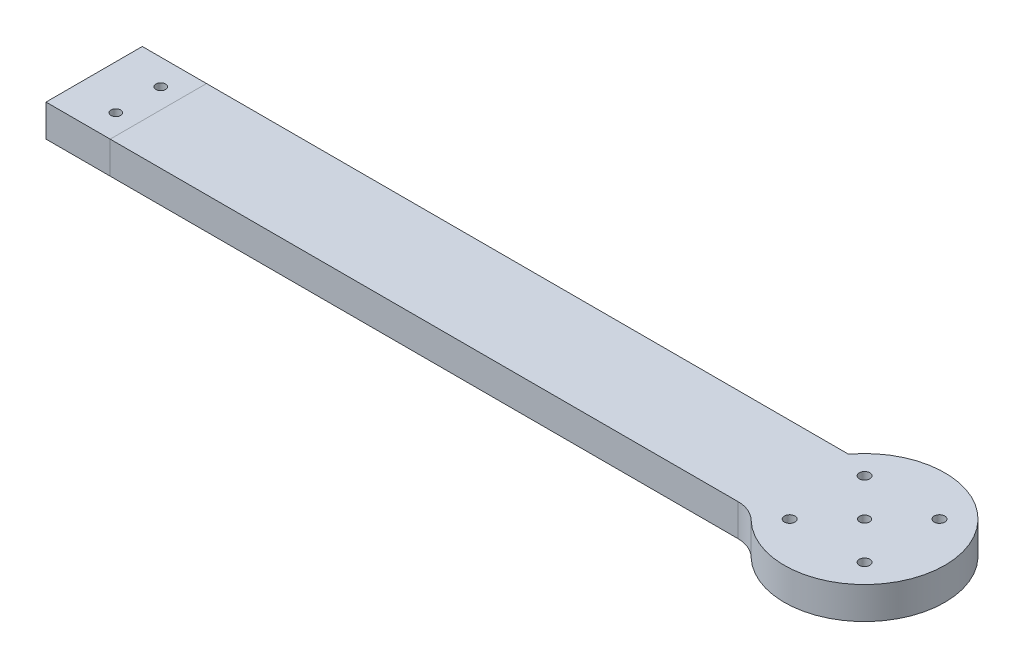
ISO-10303-21;
HEADER;
FILE_DESCRIPTION(('STEP AP214'),'2;1');
FILE_NAME('part.step','',(''),(''),'','','');
FILE_SCHEMA(('AUTOMOTIVE_DESIGN { 1 0 10303 214 1 1 1 1 }'));
ENDSEC;
DATA;
#1=APPLICATION_CONTEXT('core data for automotive mechanical design processes');
#2=APPLICATION_PROTOCOL_DEFINITION('international standard','automotive_design',2000,#1);
#3=PRODUCT_CONTEXT('',#1,'mechanical');
#4=PRODUCT('Part','Part','',(#3));
#5=PRODUCT_RELATED_PRODUCT_CATEGORY('part','',(#4));
#6=PRODUCT_DEFINITION_FORMATION('','',#4);
#7=PRODUCT_DEFINITION_CONTEXT('part definition',#1,'design');
#8=PRODUCT_DEFINITION('design','',#6,#7);
#9=PRODUCT_DEFINITION_SHAPE('','',#8);
#10=(LENGTH_UNIT() NAMED_UNIT(*) SI_UNIT(.MILLI.,.METRE.));
#11=(NAMED_UNIT(*) PLANE_ANGLE_UNIT() SI_UNIT($,.RADIAN.));
#12=(NAMED_UNIT(*) SI_UNIT($,.STERADIAN.) SOLID_ANGLE_UNIT());
#13=UNCERTAINTY_MEASURE_WITH_UNIT(LENGTH_MEASURE(1.E-05),#10,'distance_accuracy_value','');
#14=(GEOMETRIC_REPRESENTATION_CONTEXT(3) GLOBAL_UNCERTAINTY_ASSIGNED_CONTEXT((#13)) GLOBAL_UNIT_ASSIGNED_CONTEXT((#10,
#11,#12)) REPRESENTATION_CONTEXT('',''));
#15=CARTESIAN_POINT('',(0.,0.,0.));
#16=DIRECTION('',(0.,0.,1.));
#17=DIRECTION('',(1.,0.,0.));
#18=AXIS2_PLACEMENT_3D('',#15,#16,#17);
#19=CARTESIAN_POINT('',(-20.,10.,-30.));
#20=DIRECTION('',(0.,0.,1.));
#21=DIRECTION('',(1.,0.,0.));
#22=AXIS2_PLACEMENT_3D('',#19,#20,#21);
#23=PLANE('',#22);
#24=DIRECTION('',(0.,-1.,0.));
#25=VECTOR('',#24,1.);
#26=CARTESIAN_POINT('',(0.,10.,-30.));
#27=LINE('',#26,#25);
#28=CARTESIAN_POINT('',(0.,10.,-30.));
#29=VERTEX_POINT('',#28);
#30=CARTESIAN_POINT('',(0.,0.,-30.));
#31=VERTEX_POINT('',#30);
#32=EDGE_CURVE('E120',#29,#31,#27,.T.);
#33=ORIENTED_EDGE('',*,*,#32,.T.);
#34=DIRECTION('',(1.,0.,0.));
#35=VECTOR('',#34,1.);
#36=CARTESIAN_POINT('',(-20.,0.,-30.));
#37=LINE('',#36,#35);
#38=CARTESIAN_POINT('',(-20.,0.,-30.));
#39=VERTEX_POINT('',#38);
#40=EDGE_CURVE('E12',#39,#31,#37,.T.);
#41=ORIENTED_EDGE('',*,*,#40,.F.);
#42=DIRECTION('',(0.,-1.,0.));
#43=VECTOR('',#42,1.);
#44=CARTESIAN_POINT('',(-20.,10.,-30.));
#45=LINE('',#44,#43);
#46=CARTESIAN_POINT('',(-20.,10.,-30.));
#47=VERTEX_POINT('',#46);
#48=EDGE_CURVE('E108',#47,#39,#45,.T.);
#49=ORIENTED_EDGE('',*,*,#48,.F.);
#50=DIRECTION('',(1.,0.,0.));
#51=VECTOR('',#50,1.);
#52=CARTESIAN_POINT('',(-20.,10.,-30.));
#53=LINE('',#52,#51);
#54=EDGE_CURVE('E116',#47,#29,#53,.T.);
#55=ORIENTED_EDGE('',*,*,#54,.T.);
#56=EDGE_LOOP('',(#33,#41,#49,#55));
#57=FACE_BOUND('',#56,.T.);
#58=ADVANCED_FACE('F57',(#57),#23,.F.);
#59=CARTESIAN_POINT('',(-20.,0.,-30.));
#60=DIRECTION('',(0.,1.,0.));
#61=DIRECTION('',(0.,0.,1.));
#62=AXIS2_PLACEMENT_3D('',#59,#60,#61);
#63=PLANE('',#62);
#64=CARTESIAN_POINT('',(-6.25,0.,-8.));
#65=DIRECTION('',(0.,1.,0.));
#66=DIRECTION('',(0.,0.,1.));
#67=AXIS2_PLACEMENT_3D('',#64,#65,#66);
#68=CIRCLE('',#67,1.5);
#69=CARTESIAN_POINT('',(-6.25,0.,-6.5));
#70=VERTEX_POINT('',#69);
#71=EDGE_CURVE('E123',#70,#70,#68,.F.);
#72=ORIENTED_EDGE('',*,*,#71,.F.);
#73=EDGE_LOOP('',(#72));
#74=FACE_BOUND('',#73,.T.);
#75=CARTESIAN_POINT('',(-6.25,0.,-22.));
#76=DIRECTION('',(0.,1.,0.));
#77=DIRECTION('',(0.,0.,1.));
#78=AXIS2_PLACEMENT_3D('',#75,#76,#77);
#79=CIRCLE('',#78,1.5);
#80=CARTESIAN_POINT('',(-6.25,0.,-20.5));
#81=VERTEX_POINT('',#80);
#82=EDGE_CURVE('E138',#81,#81,#79,.F.);
#83=ORIENTED_EDGE('',*,*,#82,.F.);
#84=EDGE_LOOP('',(#83));
#85=FACE_BOUND('',#84,.T.);
#86=DIRECTION('',(0.,0.,1.));
#87=VECTOR('',#86,1.);
#88=CARTESIAN_POINT('',(0.,0.,-30.));
#89=LINE('',#88,#87);
#90=CARTESIAN_POINT('',(0.,0.,0.));
#91=VERTEX_POINT('',#90);
#92=EDGE_CURVE('E112',#31,#91,#89,.T.);
#93=ORIENTED_EDGE('',*,*,#92,.T.);
#94=DIRECTION('',(1.,0.,0.));
#95=VECTOR('',#94,1.);
#96=CARTESIAN_POINT('',(-20.,0.,0.));
#97=LINE('',#96,#95);
#98=CARTESIAN_POINT('',(-20.,0.,0.));
#99=VERTEX_POINT('',#98);
#100=EDGE_CURVE('E65',#99,#91,#97,.T.);
#101=ORIENTED_EDGE('',*,*,#100,.F.);
#102=DIRECTION('',(0.,0.,1.));
#103=VECTOR('',#102,1.);
#104=CARTESIAN_POINT('',(-20.,0.,-30.));
#105=LINE('',#104,#103);
#106=EDGE_CURVE('E103',#39,#99,#105,.T.);
#107=ORIENTED_EDGE('',*,*,#106,.F.);
#108=ORIENTED_EDGE('',*,*,#40,.T.);
#109=EDGE_LOOP('',(#93,#101,#107,#108));
#110=FACE_BOUND('',#109,.T.);
#111=ADVANCED_FACE('F111',(#74,#85,#110),#63,.F.);
#112=CARTESIAN_POINT('',(-20.,0.,0.));
#113=DIRECTION('',(0.,0.,-1.));
#114=DIRECTION('',(-1.,0.,0.));
#115=AXIS2_PLACEMENT_3D('',#112,#113,#114);
#116=PLANE('',#115);
#117=DIRECTION('',(0.,1.,0.));
#118=VECTOR('',#117,1.);
#119=CARTESIAN_POINT('',(0.,0.,0.));
#120=LINE('',#119,#118);
#121=CARTESIAN_POINT('',(0.,10.,0.));
#122=VERTEX_POINT('',#121);
#123=EDGE_CURVE('E90',#91,#122,#120,.T.);
#124=ORIENTED_EDGE('',*,*,#123,.T.);
#125=DIRECTION('',(1.,0.,0.));
#126=VECTOR('',#125,1.);
#127=CARTESIAN_POINT('',(-20.,10.,0.));
#128=LINE('',#127,#126);
#129=CARTESIAN_POINT('',(-20.,10.,0.));
#130=VERTEX_POINT('',#129);
#131=EDGE_CURVE('E113',#130,#122,#128,.T.);
#132=ORIENTED_EDGE('',*,*,#131,.F.);
#133=DIRECTION('',(0.,1.,0.));
#134=VECTOR('',#133,1.);
#135=CARTESIAN_POINT('',(-20.,0.,0.));
#136=LINE('',#135,#134);
#137=EDGE_CURVE('E106',#99,#130,#136,.T.);
#138=ORIENTED_EDGE('',*,*,#137,.F.);
#139=ORIENTED_EDGE('',*,*,#100,.T.);
#140=EDGE_LOOP('',(#124,#132,#138,#139));
#141=FACE_BOUND('',#140,.T.);
#142=ADVANCED_FACE('F114',(#141),#116,.F.);
#143=CARTESIAN_POINT('',(-20.,10.,0.));
#144=DIRECTION('',(0.,-1.,0.));
#145=DIRECTION('',(0.,0.,-1.));
#146=AXIS2_PLACEMENT_3D('',#143,#144,#145);
#147=PLANE('',#146);
#148=CARTESIAN_POINT('',(-6.25,10.,-8.));
#149=DIRECTION('',(0.,1.,0.));
#150=DIRECTION('',(0.,0.,1.));
#151=AXIS2_PLACEMENT_3D('',#148,#149,#150);
#152=CIRCLE('',#151,1.5);
#153=CARTESIAN_POINT('',(-6.25,10.,-6.5));
#154=VERTEX_POINT('',#153);
#155=EDGE_CURVE('E137',#154,#154,#152,.T.);
#156=ORIENTED_EDGE('',*,*,#155,.F.);
#157=EDGE_LOOP('',(#156));
#158=FACE_BOUND('',#157,.T.);
#159=CARTESIAN_POINT('',(-6.25,10.,-22.));
#160=DIRECTION('',(0.,1.,0.));
#161=DIRECTION('',(0.,0.,1.));
#162=AXIS2_PLACEMENT_3D('',#159,#160,#161);
#163=CIRCLE('',#162,1.5);
#164=CARTESIAN_POINT('',(-6.25,10.,-20.5));
#165=VERTEX_POINT('',#164);
#166=EDGE_CURVE('E134',#165,#165,#163,.T.);
#167=ORIENTED_EDGE('',*,*,#166,.F.);
#168=EDGE_LOOP('',(#167));
#169=FACE_BOUND('',#168,.T.);
#170=DIRECTION('',(0.,0.,-1.));
#171=VECTOR('',#170,1.);
#172=CARTESIAN_POINT('',(0.,10.,0.));
#173=LINE('',#172,#171);
#174=EDGE_CURVE('E96',#122,#29,#173,.T.);
#175=ORIENTED_EDGE('',*,*,#174,.T.);
#176=ORIENTED_EDGE('',*,*,#54,.F.);
#177=DIRECTION('',(0.,0.,-1.));
#178=VECTOR('',#177,1.);
#179=CARTESIAN_POINT('',(-20.,10.,0.));
#180=LINE('',#179,#178);
#181=EDGE_CURVE('E73',#130,#47,#180,.T.);
#182=ORIENTED_EDGE('',*,*,#181,.F.);
#183=ORIENTED_EDGE('',*,*,#131,.T.);
#184=EDGE_LOOP('',(#175,#176,#182,#183));
#185=FACE_BOUND('',#184,.T.);
#186=ADVANCED_FACE('F128',(#158,#169,#185),#147,.F.);
#187=CARTESIAN_POINT('',(-20.,0.,0.));
#188=DIRECTION('',(-1.,0.,0.));
#189=DIRECTION('',(0.,0.,1.));
#190=AXIS2_PLACEMENT_3D('',#187,#188,#189);
#191=PLANE('',#190);
#192=ORIENTED_EDGE('',*,*,#48,.T.);
#193=ORIENTED_EDGE('',*,*,#106,.T.);
#194=ORIENTED_EDGE('',*,*,#137,.T.);
#195=ORIENTED_EDGE('',*,*,#181,.T.);
#196=EDGE_LOOP('',(#192,#193,#194,#195));
#197=FACE_BOUND('',#196,.T.);
#198=ADVANCED_FACE('F104',(#197),#191,.T.);
#199=CARTESIAN_POINT('',(0.,0.,0.));
#200=DIRECTION('',(-1.,0.,0.));
#201=DIRECTION('',(0.,0.,1.));
#202=AXIS2_PLACEMENT_3D('',#199,#200,#201);
#203=PLANE('',#202);
#204=ORIENTED_EDGE('',*,*,#32,.F.);
#205=ORIENTED_EDGE('',*,*,#174,.F.);
#206=ORIENTED_EDGE('',*,*,#123,.F.);
#207=ORIENTED_EDGE('',*,*,#92,.F.);
#208=EDGE_LOOP('',(#204,#205,#206,#207));
#209=FACE_BOUND('',#208,.T.);
#210=ADVANCED_FACE('F131',(#209),#203,.F.);
#211=CARTESIAN_POINT('',(-6.25,-4.24264068711929,-22.));
#212=DIRECTION('',(0.,1.,0.));
#213=DIRECTION('',(0.,0.,1.));
#214=AXIS2_PLACEMENT_3D('',#211,#212,#213);
#215=CYLINDRICAL_SURFACE('',#214,1.5);
#216=ORIENTED_EDGE('',*,*,#82,.T.);
#217=EDGE_LOOP('',(#216));
#218=FACE_BOUND('',#217,.T.);
#219=ORIENTED_EDGE('',*,*,#166,.T.);
#220=EDGE_LOOP('',(#219));
#221=FACE_BOUND('',#220,.T.);
#222=ADVANCED_FACE('F153',(#218,#221),#215,.F.);
#223=CARTESIAN_POINT('',(-6.25,-4.24264068711929,-8.));
#224=DIRECTION('',(0.,1.,0.));
#225=DIRECTION('',(0.,0.,1.));
#226=AXIS2_PLACEMENT_3D('',#223,#224,#225);
#227=CYLINDRICAL_SURFACE('',#226,1.5);
#228=ORIENTED_EDGE('',*,*,#71,.T.);
#229=EDGE_LOOP('',(#228));
#230=FACE_BOUND('',#229,.T.);
#231=ORIENTED_EDGE('',*,*,#155,.T.);
#232=EDGE_LOOP('',(#231));
#233=FACE_BOUND('',#232,.T.);
#234=ADVANCED_FACE('F146',(#230,#233),#227,.F.);
#235=CLOSED_SHELL('',(#58,#111,#142,#186,#198,#210,#222,#234));
#236=MANIFOLD_SOLID_BREP('B2',#235);
#237=CARTESIAN_POINT('',(0.,10.,0.));
#238=DIRECTION('',(1.,0.,0.));
#239=DIRECTION('',(0.,0.,-1.));
#240=AXIS2_PLACEMENT_3D('',#237,#238,#239);
#241=PLANE('',#240);
#242=DIRECTION('',(0.,0.,1.));
#243=VECTOR('',#242,1.);
#244=CARTESIAN_POINT('',(0.,0.,0.));
#245=LINE('',#244,#243);
#246=CARTESIAN_POINT('',(0.,0.,-30.));
#247=VERTEX_POINT('',#246);
#248=CARTESIAN_POINT('',(0.,0.,0.));
#249=VERTEX_POINT('',#248);
#250=EDGE_CURVE('E290',#247,#249,#245,.T.);
#251=ORIENTED_EDGE('',*,*,#250,.T.);
#252=DIRECTION('',(0.,-1.,0.));
#253=VECTOR('',#252,1.);
#254=CARTESIAN_POINT('',(0.,10.,0.));
#255=LINE('',#254,#253);
#256=CARTESIAN_POINT('',(0.,10.,0.));
#257=VERTEX_POINT('',#256);
#258=EDGE_CURVE('E271',#257,#249,#255,.T.);
#259=ORIENTED_EDGE('',*,*,#258,.F.);
#260=DIRECTION('',(0.,0.,1.));
#261=VECTOR('',#260,1.);
#262=CARTESIAN_POINT('',(0.,10.,0.));
#263=LINE('',#262,#261);
#264=CARTESIAN_POINT('',(0.,10.,-30.));
#265=VERTEX_POINT('',#264);
#266=EDGE_CURVE('E277',#265,#257,#263,.T.);
#267=ORIENTED_EDGE('',*,*,#266,.F.);
#268=DIRECTION('',(0.,-1.,0.));
#269=VECTOR('',#268,1.);
#270=CARTESIAN_POINT('',(0.,10.,-30.));
#271=LINE('',#270,#269);
#272=EDGE_CURVE('E300',#265,#247,#271,.T.);
#273=ORIENTED_EDGE('',*,*,#272,.T.);
#274=EDGE_LOOP('',(#251,#259,#267,#273));
#275=FACE_BOUND('',#274,.T.);
#276=ADVANCED_FACE('F223',(#275),#241,.F.);
#277=CARTESIAN_POINT('',(0.,10.,0.));
#278=DIRECTION('',(0.,0.,-1.));
#279=DIRECTION('',(-1.,0.,0.));
#280=AXIS2_PLACEMENT_3D('',#277,#278,#279);
#281=PLANE('',#280);
#282=DIRECTION('',(1.,0.,0.));
#283=VECTOR('',#282,1.);
#284=CARTESIAN_POINT('',(0.,0.,0.));
#285=LINE('',#284,#283);
#286=CARTESIAN_POINT('',(195.505102572168,0.,0.));
#287=VERTEX_POINT('',#286);
#288=EDGE_CURVE('E313',#249,#287,#285,.T.);
#289=ORIENTED_EDGE('',*,*,#288,.T.);
#290=DIRECTION('',(0.,1.,0.));
#291=VECTOR('',#290,1.);
#292=CARTESIAN_POINT('',(195.505102572168,10.,0.));
#293=LINE('',#292,#291);
#294=CARTESIAN_POINT('',(195.505102572168,10.,0.));
#295=VERTEX_POINT('',#294);
#296=EDGE_CURVE('E239',#287,#295,#293,.T.);
#297=ORIENTED_EDGE('',*,*,#296,.T.);
#298=DIRECTION('',(1.,0.,0.));
#299=VECTOR('',#298,1.);
#300=CARTESIAN_POINT('',(0.,10.,0.));
#301=LINE('',#300,#299);
#302=EDGE_CURVE('E267',#257,#295,#301,.T.);
#303=ORIENTED_EDGE('',*,*,#302,.F.);
#304=ORIENTED_EDGE('',*,*,#258,.T.);
#305=EDGE_LOOP('',(#289,#297,#303,#304));
#306=FACE_BOUND('',#305,.T.);
#307=ADVANCED_FACE('F269',(#306),#281,.F.);
#308=CARTESIAN_POINT('',(220.,10.,-15.));
#309=DIRECTION('',(0.,-1.,0.));
#310=DIRECTION('',(0.,0.,-1.));
#311=AXIS2_PLACEMENT_3D('',#308,#309,#310);
#312=CYLINDRICAL_SURFACE('',#311,25.);
#313=CARTESIAN_POINT('',(220.,10.,-15.));
#314=DIRECTION('',(0.,1.,0.));
#315=DIRECTION('',(0.,0.,-1.));
#316=AXIS2_PLACEMENT_3D('',#313,#314,#315);
#317=CIRCLE('',#316,25.);
#318=CARTESIAN_POINT('',(202.503644694406,10.,2.85714285714285));
#319=VERTEX_POINT('',#318);
#320=CARTESIAN_POINT('',(200.,10.,-30.));
#321=VERTEX_POINT('',#320);
#322=EDGE_CURVE('E276',#319,#321,#317,.T.);
#323=ORIENTED_EDGE('',*,*,#322,.F.);
#324=DIRECTION('',(0.,-1.,0.));
#325=VECTOR('',#324,1.);
#326=CARTESIAN_POINT('',(202.503644694406,10.,2.85714285714285));
#327=LINE('',#326,#325);
#328=CARTESIAN_POINT('',(202.503644694406,0.,2.85714285714285));
#329=VERTEX_POINT('',#328);
#330=EDGE_CURVE('E292',#319,#329,#327,.T.);
#331=ORIENTED_EDGE('',*,*,#330,.T.);
#332=CARTESIAN_POINT('',(220.,0.,-15.));
#333=DIRECTION('',(0.,1.,0.));
#334=DIRECTION('',(0.,0.,-1.));
#335=AXIS2_PLACEMENT_3D('',#332,#333,#334);
#336=CIRCLE('',#335,25.);
#337=CARTESIAN_POINT('',(200.,0.,-30.));
#338=VERTEX_POINT('',#337);
#339=EDGE_CURVE('E310',#329,#338,#336,.T.);
#340=ORIENTED_EDGE('',*,*,#339,.T.);
#341=DIRECTION('',(0.,-1.,0.));
#342=VECTOR('',#341,1.);
#343=CARTESIAN_POINT('',(200.,10.,-30.));
#344=LINE('',#343,#342);
#345=EDGE_CURVE('E293',#321,#338,#344,.T.);
#346=ORIENTED_EDGE('',*,*,#345,.F.);
#347=EDGE_LOOP('',(#323,#331,#340,#346));
#348=FACE_BOUND('',#347,.T.);
#349=ADVANCED_FACE('F386',(#348),#312,.T.);
#350=CARTESIAN_POINT('',(0.,10.,-30.));
#351=DIRECTION('',(0.,0.,1.));
#352=DIRECTION('',(1.,0.,0.));
#353=AXIS2_PLACEMENT_3D('',#350,#351,#352);
#354=PLANE('',#353);
#355=DIRECTION('',(-1.,0.,0.));
#356=VECTOR('',#355,1.);
#357=CARTESIAN_POINT('',(0.,0.,-30.));
#358=LINE('',#357,#356);
#359=EDGE_CURVE('E287',#338,#247,#358,.T.);
#360=ORIENTED_EDGE('',*,*,#359,.T.);
#361=ORIENTED_EDGE('',*,*,#272,.F.);
#362=DIRECTION('',(-1.,0.,0.));
#363=VECTOR('',#362,1.);
#364=CARTESIAN_POINT('',(0.,10.,-30.));
#365=LINE('',#364,#363);
#366=EDGE_CURVE('E282',#321,#265,#365,.T.);
#367=ORIENTED_EDGE('',*,*,#366,.F.);
#368=ORIENTED_EDGE('',*,*,#345,.T.);
#369=EDGE_LOOP('',(#360,#361,#367,#368));
#370=FACE_BOUND('',#369,.T.);
#371=ADVANCED_FACE('F391',(#370),#354,.F.);
#372=CARTESIAN_POINT('',(220.,10.,-15.));
#373=DIRECTION('',(0.,-1.,0.));
#374=DIRECTION('',(0.,0.,-1.));
#375=AXIS2_PLACEMENT_3D('',#372,#373,#374);
#376=PLANE('',#375);
#377=CARTESIAN_POINT('',(208.332738110422,10.,-26.6672618895781));
#378=DIRECTION('',(0.,1.,0.));
#379=DIRECTION('',(0.,0.,1.));
#380=AXIS2_PLACEMENT_3D('',#377,#378,#379);
#381=CIRCLE('',#380,1.65000000000002);
#382=CARTESIAN_POINT('',(208.332738110422,10.,-25.0172618895781));
#383=VERTEX_POINT('',#382);
#384=EDGE_CURVE('E331',#383,#383,#381,.T.);
#385=ORIENTED_EDGE('',*,*,#384,.F.);
#386=EDGE_LOOP('',(#385));
#387=FACE_BOUND('',#386,.T.);
#388=CARTESIAN_POINT('',(208.332738110422,10.,-3.332738110422));
#389=DIRECTION('',(0.,1.,0.));
#390=DIRECTION('',(0.,0.,1.));
#391=AXIS2_PLACEMENT_3D('',#388,#389,#390);
#392=CIRCLE('',#391,1.65000000000002);
#393=CARTESIAN_POINT('',(208.332738110422,10.,-1.68273811042198));
#394=VERTEX_POINT('',#393);
#395=EDGE_CURVE('E340',#394,#394,#392,.T.);
#396=ORIENTED_EDGE('',*,*,#395,.F.);
#397=EDGE_LOOP('',(#396));
#398=FACE_BOUND('',#397,.T.);
#399=CARTESIAN_POINT('',(231.667261889578,10.,-3.33273811042195));
#400=DIRECTION('',(0.,1.,0.));
#401=DIRECTION('',(0.,0.,1.));
#402=AXIS2_PLACEMENT_3D('',#399,#400,#401);
#403=CIRCLE('',#402,1.65000000000002);
#404=CARTESIAN_POINT('',(231.667261889578,10.,-1.68273811042193));
#405=VERTEX_POINT('',#404);
#406=EDGE_CURVE('E348',#405,#405,#403,.T.);
#407=ORIENTED_EDGE('',*,*,#406,.F.);
#408=EDGE_LOOP('',(#407));
#409=FACE_BOUND('',#408,.T.);
#410=CARTESIAN_POINT('',(231.667261889578,10.,-26.6672618895781));
#411=DIRECTION('',(0.,1.,0.));
#412=DIRECTION('',(0.,0.,1.));
#413=AXIS2_PLACEMENT_3D('',#410,#411,#412);
#414=CIRCLE('',#413,1.65000000000002);
#415=CARTESIAN_POINT('',(231.667261889578,10.,-25.017261889578));
#416=VERTEX_POINT('',#415);
#417=EDGE_CURVE('E330',#416,#416,#414,.T.);
#418=ORIENTED_EDGE('',*,*,#417,.F.);
#419=EDGE_LOOP('',(#418));
#420=FACE_BOUND('',#419,.T.);
#421=CARTESIAN_POINT('',(220.,10.,-15.));
#422=DIRECTION('',(0.,1.,0.));
#423=DIRECTION('',(0.,0.,1.));
#424=AXIS2_PLACEMENT_3D('',#421,#422,#423);
#425=CIRCLE('',#424,1.54999999999999);
#426=CARTESIAN_POINT('',(220.,10.,-13.45));
#427=VERTEX_POINT('',#426);
#428=EDGE_CURVE('E326',#427,#427,#425,.T.);
#429=ORIENTED_EDGE('',*,*,#428,.F.);
#430=EDGE_LOOP('',(#429));
#431=FACE_BOUND('',#430,.T.);
#432=ORIENTED_EDGE('',*,*,#266,.T.);
#433=ORIENTED_EDGE('',*,*,#302,.T.);
#434=CARTESIAN_POINT('',(195.505102572168,10.,10.));
#435=DIRECTION('',(0.,-1.,0.));
#436=DIRECTION('',(0.,0.,-1.));
#437=AXIS2_PLACEMENT_3D('',#434,#435,#436);
#438=CIRCLE('',#437,10.);
#439=EDGE_CURVE('E55',#295,#319,#438,.T.);
#440=ORIENTED_EDGE('',*,*,#439,.T.);
#441=ORIENTED_EDGE('',*,*,#322,.T.);
#442=ORIENTED_EDGE('',*,*,#366,.T.);
#443=EDGE_LOOP('',(#432,#433,#440,#441,#442));
#444=FACE_BOUND('',#443,.T.);
#445=ADVANCED_FACE('F280',(#387,#398,#409,#420,#431,#444),#376,.F.);
#446=CARTESIAN_POINT('',(220.,0.,-15.));
#447=DIRECTION('',(0.,-1.,0.));
#448=DIRECTION('',(0.,0.,-1.));
#449=AXIS2_PLACEMENT_3D('',#446,#447,#448);
#450=PLANE('',#449);
#451=CARTESIAN_POINT('',(208.332738110422,0.,-26.6672618895781));
#452=DIRECTION('',(0.,-1.,0.));
#453=DIRECTION('',(0.,0.,-1.));
#454=AXIS2_PLACEMENT_3D('',#451,#452,#453);
#455=CIRCLE('',#454,1.65000000000002);
#456=CARTESIAN_POINT('',(208.332738110422,0.,-25.0172618895781));
#457=VERTEX_POINT('',#456);
#458=EDGE_CURVE('E336',#457,#457,#455,.F.);
#459=ORIENTED_EDGE('',*,*,#458,.T.);
#460=EDGE_LOOP('',(#459));
#461=FACE_BOUND('',#460,.T.);
#462=CARTESIAN_POINT('',(208.332738110422,0.,-3.332738110422));
#463=DIRECTION('',(0.,-1.,0.));
#464=DIRECTION('',(0.,0.,-1.));
#465=AXIS2_PLACEMENT_3D('',#462,#463,#464);
#466=CIRCLE('',#465,1.65000000000002);
#467=CARTESIAN_POINT('',(208.332738110422,0.,-1.68273811042198));
#468=VERTEX_POINT('',#467);
#469=EDGE_CURVE('E335',#468,#468,#466,.F.);
#470=ORIENTED_EDGE('',*,*,#469,.T.);
#471=EDGE_LOOP('',(#470));
#472=FACE_BOUND('',#471,.T.);
#473=CARTESIAN_POINT('',(231.667261889578,0.,-3.33273811042195));
#474=DIRECTION('',(0.,-1.,0.));
#475=DIRECTION('',(0.,0.,-1.));
#476=AXIS2_PLACEMENT_3D('',#473,#474,#475);
#477=CIRCLE('',#476,1.65000000000002);
#478=CARTESIAN_POINT('',(231.667261889578,0.,-1.68273811042193));
#479=VERTEX_POINT('',#478);
#480=EDGE_CURVE('E344',#479,#479,#477,.F.);
#481=ORIENTED_EDGE('',*,*,#480,.T.);
#482=EDGE_LOOP('',(#481));
#483=FACE_BOUND('',#482,.T.);
#484=CARTESIAN_POINT('',(231.667261889578,0.,-26.6672618895781));
#485=DIRECTION('',(0.,-1.,0.));
#486=DIRECTION('',(0.,0.,-1.));
#487=AXIS2_PLACEMENT_3D('',#484,#485,#486);
#488=CIRCLE('',#487,1.65000000000002);
#489=CARTESIAN_POINT('',(231.667261889578,0.,-25.017261889578));
#490=VERTEX_POINT('',#489);
#491=EDGE_CURVE('E352',#490,#490,#488,.F.);
#492=ORIENTED_EDGE('',*,*,#491,.T.);
#493=EDGE_LOOP('',(#492));
#494=FACE_BOUND('',#493,.T.);
#495=CARTESIAN_POINT('',(220.,0.,-15.));
#496=DIRECTION('',(0.,-1.,0.));
#497=DIRECTION('',(0.,0.,-1.));
#498=AXIS2_PLACEMENT_3D('',#495,#496,#497);
#499=CIRCLE('',#498,1.54999999999999);
#500=CARTESIAN_POINT('',(220.,0.,-13.45));
#501=VERTEX_POINT('',#500);
#502=EDGE_CURVE('E318',#501,#501,#499,.F.);
#503=ORIENTED_EDGE('',*,*,#502,.T.);
#504=EDGE_LOOP('',(#503));
#505=FACE_BOUND('',#504,.T.);
#506=ORIENTED_EDGE('',*,*,#250,.F.);
#507=ORIENTED_EDGE('',*,*,#359,.F.);
#508=ORIENTED_EDGE('',*,*,#339,.F.);
#509=CARTESIAN_POINT('',(195.505102572168,0.,10.));
#510=DIRECTION('',(0.,-1.,0.));
#511=DIRECTION('',(0.,0.,-1.));
#512=AXIS2_PLACEMENT_3D('',#509,#510,#511);
#513=CIRCLE('',#512,10.);
#514=EDGE_CURVE('E232',#329,#287,#513,.F.);
#515=ORIENTED_EDGE('',*,*,#514,.T.);
#516=ORIENTED_EDGE('',*,*,#288,.F.);
#517=EDGE_LOOP('',(#506,#507,#508,#515,#516));
#518=FACE_BOUND('',#517,.T.);
#519=ADVANCED_FACE('F363',(#461,#472,#483,#494,#505,#518),#450,.T.);
#520=CARTESIAN_POINT('',(220.,-4.66690475583126,-15.));
#521=DIRECTION('',(0.,1.,0.));
#522=DIRECTION('',(0.,0.,1.));
#523=AXIS2_PLACEMENT_3D('',#520,#521,#522);
#524=CYLINDRICAL_SURFACE('',#523,1.54999999999999);
#525=CARTESIAN_POINT('',(220.,10.,-13.45));
#526=CARTESIAN_POINT('',(220.,9.89583333333333,-13.45));
#527=CARTESIAN_POINT('',(220.,9.79166666666667,-13.45));
#528=CARTESIAN_POINT('',(220.,9.58333333333333,-13.45));
#529=CARTESIAN_POINT('',(220.,9.47916666666667,-13.45));
#530=CARTESIAN_POINT('',(220.,9.27083333333333,-13.45));
#531=CARTESIAN_POINT('',(220.,9.16666666666667,-13.45));
#532=CARTESIAN_POINT('',(220.,8.95833333333333,-13.45));
#533=CARTESIAN_POINT('',(220.,8.85416666666667,-13.45));
#534=CARTESIAN_POINT('',(220.,8.64583333333333,-13.45));
#535=CARTESIAN_POINT('',(220.,8.54166666666667,-13.45));
#536=CARTESIAN_POINT('',(220.,8.33333333333333,-13.45));
#537=CARTESIAN_POINT('',(220.,8.22916666666667,-13.45));
#538=CARTESIAN_POINT('',(220.,8.02083333333333,-13.45));
#539=CARTESIAN_POINT('',(220.,7.91666666666667,-13.45));
#540=CARTESIAN_POINT('',(220.,7.70833333333333,-13.45));
#541=CARTESIAN_POINT('',(220.,7.60416666666667,-13.45));
#542=CARTESIAN_POINT('',(220.,7.39583333333333,-13.45));
#543=CARTESIAN_POINT('',(220.,7.29166666666667,-13.45));
#544=CARTESIAN_POINT('',(220.,7.08333333333333,-13.45));
#545=CARTESIAN_POINT('',(220.,6.97916666666667,-13.45));
#546=CARTESIAN_POINT('',(220.,6.77083333333333,-13.45));
#547=CARTESIAN_POINT('',(220.,6.66666666666667,-13.45));
#548=CARTESIAN_POINT('',(220.,6.45833333333333,-13.45));
#549=CARTESIAN_POINT('',(220.,6.35416666666667,-13.45));
#550=CARTESIAN_POINT('',(220.,6.14583333333333,-13.45));
#551=CARTESIAN_POINT('',(220.,6.04166666666667,-13.45));
#552=CARTESIAN_POINT('',(220.,5.83333333333333,-13.45));
#553=CARTESIAN_POINT('',(220.,5.72916666666667,-13.45));
#554=CARTESIAN_POINT('',(220.,5.52083333333333,-13.45));
#555=CARTESIAN_POINT('',(220.,5.41666666666667,-13.45));
#556=CARTESIAN_POINT('',(220.,5.20833333333333,-13.45));
#557=CARTESIAN_POINT('',(220.,5.10416666666667,-13.45));
#558=CARTESIAN_POINT('',(220.,4.89583333333333,-13.45));
#559=CARTESIAN_POINT('',(220.,4.79166666666667,-13.45));
#560=CARTESIAN_POINT('',(220.,4.58333333333333,-13.45));
#561=CARTESIAN_POINT('',(220.,4.47916666666667,-13.45));
#562=CARTESIAN_POINT('',(220.,4.27083333333333,-13.45));
#563=CARTESIAN_POINT('',(220.,4.16666666666667,-13.45));
#564=CARTESIAN_POINT('',(220.,3.95833333333333,-13.45));
#565=CARTESIAN_POINT('',(220.,3.85416666666667,-13.45));
#566=CARTESIAN_POINT('',(220.,3.64583333333333,-13.45));
#567=CARTESIAN_POINT('',(220.,3.54166666666667,-13.45));
#568=CARTESIAN_POINT('',(220.,3.33333333333333,-13.45));
#569=CARTESIAN_POINT('',(220.,3.22916666666667,-13.45));
#570=CARTESIAN_POINT('',(220.,3.02083333333333,-13.45));
#571=CARTESIAN_POINT('',(220.,2.91666666666667,-13.45));
#572=CARTESIAN_POINT('',(220.,2.70833333333333,-13.45));
#573=CARTESIAN_POINT('',(220.,2.60416666666667,-13.45));
#574=CARTESIAN_POINT('',(220.,2.39583333333333,-13.45));
#575=CARTESIAN_POINT('',(220.,2.29166666666667,-13.45));
#576=CARTESIAN_POINT('',(220.,2.08333333333333,-13.45));
#577=CARTESIAN_POINT('',(220.,1.97916666666667,-13.45));
#578=CARTESIAN_POINT('',(220.,1.77083333333333,-13.45));
#579=CARTESIAN_POINT('',(220.,1.66666666666667,-13.45));
#580=CARTESIAN_POINT('',(220.,1.45833333333333,-13.45));
#581=CARTESIAN_POINT('',(220.,1.35416666666667,-13.45));
#582=CARTESIAN_POINT('',(220.,1.14583333333333,-13.45));
#583=CARTESIAN_POINT('',(220.,1.04166666666667,-13.45));
#584=CARTESIAN_POINT('',(220.,0.833333333333335,-13.45));
#585=CARTESIAN_POINT('',(220.,0.729166666666668,-13.45));
#586=CARTESIAN_POINT('',(220.,0.520833333333335,-13.45));
#587=CARTESIAN_POINT('',(220.,0.416666666666668,-13.45));
#588=CARTESIAN_POINT('',(220.,0.208333333333334,-13.45));
#589=CARTESIAN_POINT('',(220.,0.104166666666668,-13.45));
#590=CARTESIAN_POINT('',(220.,0.,-13.45));
#591=B_SPLINE_CURVE_WITH_KNOTS('',3,(#525,#526,#527,#528,#529,#530,#531,#532,#533,#534,#535,
#536,#537,#538,#539,#540,#541,#542,#543,#544,#545,#546,#547,#548,#549,#550,#551,#552,#553,#554,
#555,#556,#557,#558,#559,#560,#561,#562,#563,#564,#565,#566,#567,#568,#569,#570,#571,#572,#573,
#574,#575,#576,#577,#578,#579,#580,#581,#582,#583,#584,#585,#586,#587,#588,#589,#590),
.UNSPECIFIED.,.F.,.F.,(4,2,2,2,2,2,2,2,2,2,2,2,2,2,2,2,2,2,2,2,2,2,2,2,2,2,2,2,2,2,2,2,4),(0.,
0.3125,0.625000000000001,0.937500000000001,1.25,1.5625,1.875,2.1875,2.5,2.8125,3.125,3.4375,
3.75,4.0625,4.375,4.6875,5.,5.3125,5.625,5.9375,6.25,6.5625,6.875,7.1875,7.5,7.8125,8.125,
8.4375,8.75,9.0625,9.375,9.6875,10.),.UNSPECIFIED.);
#592=EDGE_CURVE('BSEAM369',#427,#501,#591,.T.);
#593=ORIENTED_EDGE('',*,*,#428,.T.);
#594=ORIENTED_EDGE('',*,*,#502,.F.);
#595=ORIENTED_EDGE('',*,*,#592,.T.);
#596=ORIENTED_EDGE('',*,*,#592,.F.);
#597=EDGE_LOOP('',(#593,#595,#594,#596));
#598=FACE_BOUND('',#597,.T.);
#599=ADVANCED_FACE('F369',(#598),#524,.F.);
#600=CARTESIAN_POINT('',(231.667261889578,-4.66690475583126,-26.6672618895781));
#601=DIRECTION('',(0.,1.,0.));
#602=DIRECTION('',(0.,0.,1.));
#603=AXIS2_PLACEMENT_3D('',#600,#601,#602);
#604=CYLINDRICAL_SURFACE('',#603,1.65000000000002);
#605=CARTESIAN_POINT('',(231.667261889578,10.,-25.017261889578));
#606=CARTESIAN_POINT('',(231.667261889578,9.89583333333333,-25.017261889578));
#607=CARTESIAN_POINT('',(231.667261889578,9.79166666666667,-25.017261889578));
#608=CARTESIAN_POINT('',(231.667261889578,9.58333333333333,-25.017261889578));
#609=CARTESIAN_POINT('',(231.667261889578,9.47916666666667,-25.017261889578));
#610=CARTESIAN_POINT('',(231.667261889578,9.27083333333333,-25.017261889578));
#611=CARTESIAN_POINT('',(231.667261889578,9.16666666666667,-25.017261889578));
#612=CARTESIAN_POINT('',(231.667261889578,8.95833333333333,-25.017261889578));
#613=CARTESIAN_POINT('',(231.667261889578,8.85416666666667,-25.017261889578));
#614=CARTESIAN_POINT('',(231.667261889578,8.64583333333333,-25.017261889578));
#615=CARTESIAN_POINT('',(231.667261889578,8.54166666666667,-25.017261889578));
#616=CARTESIAN_POINT('',(231.667261889578,8.33333333333333,-25.017261889578));
#617=CARTESIAN_POINT('',(231.667261889578,8.22916666666667,-25.017261889578));
#618=CARTESIAN_POINT('',(231.667261889578,8.02083333333333,-25.017261889578));
#619=CARTESIAN_POINT('',(231.667261889578,7.91666666666667,-25.017261889578));
#620=CARTESIAN_POINT('',(231.667261889578,7.70833333333333,-25.017261889578));
#621=CARTESIAN_POINT('',(231.667261889578,7.60416666666667,-25.017261889578));
#622=CARTESIAN_POINT('',(231.667261889578,7.39583333333333,-25.017261889578));
#623=CARTESIAN_POINT('',(231.667261889578,7.29166666666667,-25.017261889578));
#624=CARTESIAN_POINT('',(231.667261889578,7.08333333333333,-25.017261889578));
#625=CARTESIAN_POINT('',(231.667261889578,6.97916666666667,-25.017261889578));
#626=CARTESIAN_POINT('',(231.667261889578,6.77083333333333,-25.017261889578));
#627=CARTESIAN_POINT('',(231.667261889578,6.66666666666667,-25.017261889578));
#628=CARTESIAN_POINT('',(231.667261889578,6.45833333333333,-25.017261889578));
#629=CARTESIAN_POINT('',(231.667261889578,6.35416666666667,-25.017261889578));
#630=CARTESIAN_POINT('',(231.667261889578,6.14583333333333,-25.017261889578));
#631=CARTESIAN_POINT('',(231.667261889578,6.04166666666667,-25.017261889578));
#632=CARTESIAN_POINT('',(231.667261889578,5.83333333333333,-25.017261889578));
#633=CARTESIAN_POINT('',(231.667261889578,5.72916666666667,-25.017261889578));
#634=CARTESIAN_POINT('',(231.667261889578,5.52083333333333,-25.017261889578));
#635=CARTESIAN_POINT('',(231.667261889578,5.41666666666667,-25.017261889578));
#636=CARTESIAN_POINT('',(231.667261889578,5.20833333333333,-25.017261889578));
#637=CARTESIAN_POINT('',(231.667261889578,5.10416666666667,-25.017261889578));
#638=CARTESIAN_POINT('',(231.667261889578,4.89583333333333,-25.017261889578));
#639=CARTESIAN_POINT('',(231.667261889578,4.79166666666667,-25.017261889578));
#640=CARTESIAN_POINT('',(231.667261889578,4.58333333333333,-25.017261889578));
#641=CARTESIAN_POINT('',(231.667261889578,4.47916666666667,-25.017261889578));
#642=CARTESIAN_POINT('',(231.667261889578,4.27083333333333,-25.017261889578));
#643=CARTESIAN_POINT('',(231.667261889578,4.16666666666667,-25.017261889578));
#644=CARTESIAN_POINT('',(231.667261889578,3.95833333333333,-25.017261889578));
#645=CARTESIAN_POINT('',(231.667261889578,3.85416666666667,-25.017261889578));
#646=CARTESIAN_POINT('',(231.667261889578,3.64583333333333,-25.017261889578));
#647=CARTESIAN_POINT('',(231.667261889578,3.54166666666667,-25.017261889578));
#648=CARTESIAN_POINT('',(231.667261889578,3.33333333333333,-25.017261889578));
#649=CARTESIAN_POINT('',(231.667261889578,3.22916666666667,-25.017261889578));
#650=CARTESIAN_POINT('',(231.667261889578,3.02083333333333,-25.017261889578));
#651=CARTESIAN_POINT('',(231.667261889578,2.91666666666667,-25.017261889578));
#652=CARTESIAN_POINT('',(231.667261889578,2.70833333333333,-25.017261889578));
#653=CARTESIAN_POINT('',(231.667261889578,2.60416666666667,-25.017261889578));
#654=CARTESIAN_POINT('',(231.667261889578,2.39583333333333,-25.017261889578));
#655=CARTESIAN_POINT('',(231.667261889578,2.29166666666667,-25.017261889578));
#656=CARTESIAN_POINT('',(231.667261889578,2.08333333333333,-25.017261889578));
#657=CARTESIAN_POINT('',(231.667261889578,1.97916666666667,-25.017261889578));
#658=CARTESIAN_POINT('',(231.667261889578,1.77083333333333,-25.017261889578));
#659=CARTESIAN_POINT('',(231.667261889578,1.66666666666667,-25.017261889578));
#660=CARTESIAN_POINT('',(231.667261889578,1.45833333333333,-25.017261889578));
#661=CARTESIAN_POINT('',(231.667261889578,1.35416666666667,-25.017261889578));
#662=CARTESIAN_POINT('',(231.667261889578,1.14583333333333,-25.017261889578));
#663=CARTESIAN_POINT('',(231.667261889578,1.04166666666667,-25.017261889578));
#664=CARTESIAN_POINT('',(231.667261889578,0.833333333333335,-25.017261889578));
#665=CARTESIAN_POINT('',(231.667261889578,0.729166666666668,-25.017261889578));
#666=CARTESIAN_POINT('',(231.667261889578,0.520833333333335,-25.017261889578));
#667=CARTESIAN_POINT('',(231.667261889578,0.416666666666668,-25.017261889578));
#668=CARTESIAN_POINT('',(231.667261889578,0.208333333333334,-25.017261889578));
#669=CARTESIAN_POINT('',(231.667261889578,0.104166666666668,-25.017261889578));
#670=CARTESIAN_POINT('',(231.667261889578,0.,-25.017261889578));
#671=B_SPLINE_CURVE_WITH_KNOTS('',3,(#605,#606,#607,#608,#609,#610,#611,#612,#613,#614,#615,
#616,#617,#618,#619,#620,#621,#622,#623,#624,#625,#626,#627,#628,#629,#630,#631,#632,#633,#634,
#635,#636,#637,#638,#639,#640,#641,#642,#643,#644,#645,#646,#647,#648,#649,#650,#651,#652,#653,
#654,#655,#656,#657,#658,#659,#660,#661,#662,#663,#664,#665,#666,#667,#668,#669,#670),
.UNSPECIFIED.,.F.,.F.,(4,2,2,2,2,2,2,2,2,2,2,2,2,2,2,2,2,2,2,2,2,2,2,2,2,2,2,2,2,2,2,2,4),(0.,
0.3125,0.625000000000001,0.937500000000001,1.25,1.5625,1.875,2.1875,2.5,2.8125,3.125,3.4375,
3.75,4.0625,4.375,4.6875,5.,5.3125,5.625,5.9375,6.25,6.5625,6.875,7.1875,7.5,7.8125,8.125,
8.4375,8.75,9.0625,9.375,9.6875,10.),.UNSPECIFIED.);
#672=EDGE_CURVE('BSEAM366',#416,#490,#671,.T.);
#673=ORIENTED_EDGE('',*,*,#417,.T.);
#674=ORIENTED_EDGE('',*,*,#491,.F.);
#675=ORIENTED_EDGE('',*,*,#672,.T.);
#676=ORIENTED_EDGE('',*,*,#672,.F.);
#677=EDGE_LOOP('',(#673,#675,#674,#676));
#678=FACE_BOUND('',#677,.T.);
#679=ADVANCED_FACE('F366',(#678),#604,.F.);
#680=CARTESIAN_POINT('',(231.667261889578,-4.66690475583126,-3.33273811042195));
#681=DIRECTION('',(0.,1.,0.));
#682=DIRECTION('',(0.,0.,1.));
#683=AXIS2_PLACEMENT_3D('',#680,#681,#682);
#684=CYLINDRICAL_SURFACE('',#683,1.65000000000002);
#685=CARTESIAN_POINT('',(231.667261889578,10.,-1.68273811042193));
#686=CARTESIAN_POINT('',(231.667261889578,9.89583333333333,-1.68273811042193));
#687=CARTESIAN_POINT('',(231.667261889578,9.79166666666667,-1.68273811042193));
#688=CARTESIAN_POINT('',(231.667261889578,9.58333333333333,-1.68273811042193));
#689=CARTESIAN_POINT('',(231.667261889578,9.47916666666667,-1.68273811042193));
#690=CARTESIAN_POINT('',(231.667261889578,9.27083333333333,-1.68273811042193));
#691=CARTESIAN_POINT('',(231.667261889578,9.16666666666667,-1.68273811042193));
#692=CARTESIAN_POINT('',(231.667261889578,8.95833333333333,-1.68273811042193));
#693=CARTESIAN_POINT('',(231.667261889578,8.85416666666667,-1.68273811042193));
#694=CARTESIAN_POINT('',(231.667261889578,8.64583333333333,-1.68273811042193));
#695=CARTESIAN_POINT('',(231.667261889578,8.54166666666667,-1.68273811042193));
#696=CARTESIAN_POINT('',(231.667261889578,8.33333333333333,-1.68273811042193));
#697=CARTESIAN_POINT('',(231.667261889578,8.22916666666667,-1.68273811042193));
#698=CARTESIAN_POINT('',(231.667261889578,8.02083333333333,-1.68273811042193));
#699=CARTESIAN_POINT('',(231.667261889578,7.91666666666667,-1.68273811042193));
#700=CARTESIAN_POINT('',(231.667261889578,7.70833333333333,-1.68273811042193));
#701=CARTESIAN_POINT('',(231.667261889578,7.60416666666667,-1.68273811042193));
#702=CARTESIAN_POINT('',(231.667261889578,7.39583333333333,-1.68273811042193));
#703=CARTESIAN_POINT('',(231.667261889578,7.29166666666667,-1.68273811042193));
#704=CARTESIAN_POINT('',(231.667261889578,7.08333333333333,-1.68273811042193));
#705=CARTESIAN_POINT('',(231.667261889578,6.97916666666667,-1.68273811042193));
#706=CARTESIAN_POINT('',(231.667261889578,6.77083333333333,-1.68273811042193));
#707=CARTESIAN_POINT('',(231.667261889578,6.66666666666667,-1.68273811042193));
#708=CARTESIAN_POINT('',(231.667261889578,6.45833333333333,-1.68273811042193));
#709=CARTESIAN_POINT('',(231.667261889578,6.35416666666667,-1.68273811042193));
#710=CARTESIAN_POINT('',(231.667261889578,6.14583333333333,-1.68273811042193));
#711=CARTESIAN_POINT('',(231.667261889578,6.04166666666667,-1.68273811042193));
#712=CARTESIAN_POINT('',(231.667261889578,5.83333333333333,-1.68273811042193));
#713=CARTESIAN_POINT('',(231.667261889578,5.72916666666667,-1.68273811042193));
#714=CARTESIAN_POINT('',(231.667261889578,5.52083333333333,-1.68273811042193));
#715=CARTESIAN_POINT('',(231.667261889578,5.41666666666667,-1.68273811042193));
#716=CARTESIAN_POINT('',(231.667261889578,5.20833333333333,-1.68273811042193));
#717=CARTESIAN_POINT('',(231.667261889578,5.10416666666667,-1.68273811042193));
#718=CARTESIAN_POINT('',(231.667261889578,4.89583333333333,-1.68273811042193));
#719=CARTESIAN_POINT('',(231.667261889578,4.79166666666667,-1.68273811042193));
#720=CARTESIAN_POINT('',(231.667261889578,4.58333333333333,-1.68273811042193));
#721=CARTESIAN_POINT('',(231.667261889578,4.47916666666667,-1.68273811042193));
#722=CARTESIAN_POINT('',(231.667261889578,4.27083333333333,-1.68273811042193));
#723=CARTESIAN_POINT('',(231.667261889578,4.16666666666667,-1.68273811042193));
#724=CARTESIAN_POINT('',(231.667261889578,3.95833333333333,-1.68273811042193));
#725=CARTESIAN_POINT('',(231.667261889578,3.85416666666667,-1.68273811042193));
#726=CARTESIAN_POINT('',(231.667261889578,3.64583333333333,-1.68273811042193));
#727=CARTESIAN_POINT('',(231.667261889578,3.54166666666667,-1.68273811042193));
#728=CARTESIAN_POINT('',(231.667261889578,3.33333333333333,-1.68273811042193));
#729=CARTESIAN_POINT('',(231.667261889578,3.22916666666667,-1.68273811042193));
#730=CARTESIAN_POINT('',(231.667261889578,3.02083333333333,-1.68273811042193));
#731=CARTESIAN_POINT('',(231.667261889578,2.91666666666667,-1.68273811042193));
#732=CARTESIAN_POINT('',(231.667261889578,2.70833333333333,-1.68273811042193));
#733=CARTESIAN_POINT('',(231.667261889578,2.60416666666667,-1.68273811042193));
#734=CARTESIAN_POINT('',(231.667261889578,2.39583333333333,-1.68273811042193));
#735=CARTESIAN_POINT('',(231.667261889578,2.29166666666667,-1.68273811042193));
#736=CARTESIAN_POINT('',(231.667261889578,2.08333333333333,-1.68273811042193));
#737=CARTESIAN_POINT('',(231.667261889578,1.97916666666667,-1.68273811042193));
#738=CARTESIAN_POINT('',(231.667261889578,1.77083333333333,-1.68273811042193));
#739=CARTESIAN_POINT('',(231.667261889578,1.66666666666667,-1.68273811042193));
#740=CARTESIAN_POINT('',(231.667261889578,1.45833333333333,-1.68273811042193));
#741=CARTESIAN_POINT('',(231.667261889578,1.35416666666667,-1.68273811042193));
#742=CARTESIAN_POINT('',(231.667261889578,1.14583333333333,-1.68273811042193));
#743=CARTESIAN_POINT('',(231.667261889578,1.04166666666667,-1.68273811042193));
#744=CARTESIAN_POINT('',(231.667261889578,0.833333333333335,-1.68273811042193));
#745=CARTESIAN_POINT('',(231.667261889578,0.729166666666668,-1.68273811042193));
#746=CARTESIAN_POINT('',(231.667261889578,0.520833333333335,-1.68273811042193));
#747=CARTESIAN_POINT('',(231.667261889578,0.416666666666668,-1.68273811042193));
#748=CARTESIAN_POINT('',(231.667261889578,0.208333333333334,-1.68273811042193));
#749=CARTESIAN_POINT('',(231.667261889578,0.104166666666668,-1.68273811042193));
#750=CARTESIAN_POINT('',(231.667261889578,0.,-1.68273811042193));
#751=B_SPLINE_CURVE_WITH_KNOTS('',3,(#685,#686,#687,#688,#689,#690,#691,#692,#693,#694,#695,
#696,#697,#698,#699,#700,#701,#702,#703,#704,#705,#706,#707,#708,#709,#710,#711,#712,#713,#714,
#715,#716,#717,#718,#719,#720,#721,#722,#723,#724,#725,#726,#727,#728,#729,#730,#731,#732,#733,
#734,#735,#736,#737,#738,#739,#740,#741,#742,#743,#744,#745,#746,#747,#748,#749,#750),
.UNSPECIFIED.,.F.,.F.,(4,2,2,2,2,2,2,2,2,2,2,2,2,2,2,2,2,2,2,2,2,2,2,2,2,2,2,2,2,2,2,2,4),(0.,
0.3125,0.625000000000001,0.937500000000001,1.25,1.5625,1.875,2.1875,2.5,2.8125,3.125,3.4375,
3.75,4.0625,4.375,4.6875,5.,5.3125,5.625,5.9375,6.25,6.5625,6.875,7.1875,7.5,7.8125,8.125,
8.4375,8.75,9.0625,9.375,9.6875,10.),.UNSPECIFIED.);
#752=EDGE_CURVE('BSEAM368',#405,#479,#751,.T.);
#753=ORIENTED_EDGE('',*,*,#406,.T.);
#754=ORIENTED_EDGE('',*,*,#480,.F.);
#755=ORIENTED_EDGE('',*,*,#752,.T.);
#756=ORIENTED_EDGE('',*,*,#752,.F.);
#757=EDGE_LOOP('',(#753,#755,#754,#756));
#758=FACE_BOUND('',#757,.T.);
#759=ADVANCED_FACE('F368',(#758),#684,.F.);
#760=CARTESIAN_POINT('',(208.332738110422,-4.66690475583126,-3.332738110422));
#761=DIRECTION('',(0.,1.,0.));
#762=DIRECTION('',(0.,0.,1.));
#763=AXIS2_PLACEMENT_3D('',#760,#761,#762);
#764=CYLINDRICAL_SURFACE('',#763,1.65000000000002);
#765=CARTESIAN_POINT('',(208.332738110422,10.,-1.68273811042198));
#766=CARTESIAN_POINT('',(208.332738110422,9.89583333333333,-1.68273811042198));
#767=CARTESIAN_POINT('',(208.332738110422,9.79166666666667,-1.68273811042198));
#768=CARTESIAN_POINT('',(208.332738110422,9.58333333333333,-1.68273811042198));
#769=CARTESIAN_POINT('',(208.332738110422,9.47916666666667,-1.68273811042198));
#770=CARTESIAN_POINT('',(208.332738110422,9.27083333333333,-1.68273811042198));
#771=CARTESIAN_POINT('',(208.332738110422,9.16666666666667,-1.68273811042198));
#772=CARTESIAN_POINT('',(208.332738110422,8.95833333333333,-1.68273811042198));
#773=CARTESIAN_POINT('',(208.332738110422,8.85416666666667,-1.68273811042198));
#774=CARTESIAN_POINT('',(208.332738110422,8.64583333333333,-1.68273811042198));
#775=CARTESIAN_POINT('',(208.332738110422,8.54166666666667,-1.68273811042198));
#776=CARTESIAN_POINT('',(208.332738110422,8.33333333333333,-1.68273811042198));
#777=CARTESIAN_POINT('',(208.332738110422,8.22916666666667,-1.68273811042198));
#778=CARTESIAN_POINT('',(208.332738110422,8.02083333333333,-1.68273811042198));
#779=CARTESIAN_POINT('',(208.332738110422,7.91666666666667,-1.68273811042198));
#780=CARTESIAN_POINT('',(208.332738110422,7.70833333333333,-1.68273811042198));
#781=CARTESIAN_POINT('',(208.332738110422,7.60416666666667,-1.68273811042198));
#782=CARTESIAN_POINT('',(208.332738110422,7.39583333333333,-1.68273811042198));
#783=CARTESIAN_POINT('',(208.332738110422,7.29166666666667,-1.68273811042198));
#784=CARTESIAN_POINT('',(208.332738110422,7.08333333333333,-1.68273811042198));
#785=CARTESIAN_POINT('',(208.332738110422,6.97916666666667,-1.68273811042198));
#786=CARTESIAN_POINT('',(208.332738110422,6.77083333333333,-1.68273811042198));
#787=CARTESIAN_POINT('',(208.332738110422,6.66666666666667,-1.68273811042198));
#788=CARTESIAN_POINT('',(208.332738110422,6.45833333333333,-1.68273811042198));
#789=CARTESIAN_POINT('',(208.332738110422,6.35416666666667,-1.68273811042198));
#790=CARTESIAN_POINT('',(208.332738110422,6.14583333333333,-1.68273811042198));
#791=CARTESIAN_POINT('',(208.332738110422,6.04166666666667,-1.68273811042198));
#792=CARTESIAN_POINT('',(208.332738110422,5.83333333333333,-1.68273811042198));
#793=CARTESIAN_POINT('',(208.332738110422,5.72916666666667,-1.68273811042198));
#794=CARTESIAN_POINT('',(208.332738110422,5.52083333333333,-1.68273811042198));
#795=CARTESIAN_POINT('',(208.332738110422,5.41666666666667,-1.68273811042198));
#796=CARTESIAN_POINT('',(208.332738110422,5.20833333333333,-1.68273811042198));
#797=CARTESIAN_POINT('',(208.332738110422,5.10416666666667,-1.68273811042198));
#798=CARTESIAN_POINT('',(208.332738110422,4.89583333333333,-1.68273811042198));
#799=CARTESIAN_POINT('',(208.332738110422,4.79166666666667,-1.68273811042198));
#800=CARTESIAN_POINT('',(208.332738110422,4.58333333333333,-1.68273811042198));
#801=CARTESIAN_POINT('',(208.332738110422,4.47916666666667,-1.68273811042198));
#802=CARTESIAN_POINT('',(208.332738110422,4.27083333333333,-1.68273811042198));
#803=CARTESIAN_POINT('',(208.332738110422,4.16666666666667,-1.68273811042198));
#804=CARTESIAN_POINT('',(208.332738110422,3.95833333333333,-1.68273811042198));
#805=CARTESIAN_POINT('',(208.332738110422,3.85416666666667,-1.68273811042198));
#806=CARTESIAN_POINT('',(208.332738110422,3.64583333333333,-1.68273811042198));
#807=CARTESIAN_POINT('',(208.332738110422,3.54166666666667,-1.68273811042198));
#808=CARTESIAN_POINT('',(208.332738110422,3.33333333333333,-1.68273811042198));
#809=CARTESIAN_POINT('',(208.332738110422,3.22916666666667,-1.68273811042198));
#810=CARTESIAN_POINT('',(208.332738110422,3.02083333333333,-1.68273811042198));
#811=CARTESIAN_POINT('',(208.332738110422,2.91666666666667,-1.68273811042198));
#812=CARTESIAN_POINT('',(208.332738110422,2.70833333333333,-1.68273811042198));
#813=CARTESIAN_POINT('',(208.332738110422,2.60416666666667,-1.68273811042198));
#814=CARTESIAN_POINT('',(208.332738110422,2.39583333333333,-1.68273811042198));
#815=CARTESIAN_POINT('',(208.332738110422,2.29166666666667,-1.68273811042198));
#816=CARTESIAN_POINT('',(208.332738110422,2.08333333333333,-1.68273811042198));
#817=CARTESIAN_POINT('',(208.332738110422,1.97916666666667,-1.68273811042198));
#818=CARTESIAN_POINT('',(208.332738110422,1.77083333333333,-1.68273811042198));
#819=CARTESIAN_POINT('',(208.332738110422,1.66666666666667,-1.68273811042198));
#820=CARTESIAN_POINT('',(208.332738110422,1.45833333333333,-1.68273811042198));
#821=CARTESIAN_POINT('',(208.332738110422,1.35416666666667,-1.68273811042198));
#822=CARTESIAN_POINT('',(208.332738110422,1.14583333333333,-1.68273811042198));
#823=CARTESIAN_POINT('',(208.332738110422,1.04166666666667,-1.68273811042198));
#824=CARTESIAN_POINT('',(208.332738110422,0.833333333333335,-1.68273811042198));
#825=CARTESIAN_POINT('',(208.332738110422,0.729166666666668,-1.68273811042198));
#826=CARTESIAN_POINT('',(208.332738110422,0.520833333333335,-1.68273811042198));
#827=CARTESIAN_POINT('',(208.332738110422,0.416666666666668,-1.68273811042198));
#828=CARTESIAN_POINT('',(208.332738110422,0.208333333333334,-1.68273811042198));
#829=CARTESIAN_POINT('',(208.332738110422,0.104166666666668,-1.68273811042198));
#830=CARTESIAN_POINT('',(208.332738110422,0.,-1.68273811042198));
#831=B_SPLINE_CURVE_WITH_KNOTS('',3,(#765,#766,#767,#768,#769,#770,#771,#772,#773,#774,#775,
#776,#777,#778,#779,#780,#781,#782,#783,#784,#785,#786,#787,#788,#789,#790,#791,#792,#793,#794,
#795,#796,#797,#798,#799,#800,#801,#802,#803,#804,#805,#806,#807,#808,#809,#810,#811,#812,#813,
#814,#815,#816,#817,#818,#819,#820,#821,#822,#823,#824,#825,#826,#827,#828,#829,#830),
.UNSPECIFIED.,.F.,.F.,(4,2,2,2,2,2,2,2,2,2,2,2,2,2,2,2,2,2,2,2,2,2,2,2,2,2,2,2,2,2,2,2,4),(0.,
0.3125,0.625000000000001,0.937500000000001,1.25,1.5625,1.875,2.1875,2.5,2.8125,3.125,3.4375,
3.75,4.0625,4.375,4.6875,5.,5.3125,5.625,5.9375,6.25,6.5625,6.875,7.1875,7.5,7.8125,8.125,
8.4375,8.75,9.0625,9.375,9.6875,10.),.UNSPECIFIED.);
#832=EDGE_CURVE('BSEAM376',#394,#468,#831,.T.);
#833=ORIENTED_EDGE('',*,*,#395,.T.);
#834=ORIENTED_EDGE('',*,*,#469,.F.);
#835=ORIENTED_EDGE('',*,*,#832,.T.);
#836=ORIENTED_EDGE('',*,*,#832,.F.);
#837=EDGE_LOOP('',(#833,#835,#834,#836));
#838=FACE_BOUND('',#837,.T.);
#839=ADVANCED_FACE('F376',(#838),#764,.F.);
#840=CARTESIAN_POINT('',(208.332738110422,-4.66690475583126,-26.6672618895781));
#841=DIRECTION('',(0.,1.,0.));
#842=DIRECTION('',(0.,0.,1.));
#843=AXIS2_PLACEMENT_3D('',#840,#841,#842);
#844=CYLINDRICAL_SURFACE('',#843,1.65000000000002);
#845=CARTESIAN_POINT('',(208.332738110422,10.,-25.0172618895781));
#846=CARTESIAN_POINT('',(208.332738110422,9.89583333333333,-25.0172618895781));
#847=CARTESIAN_POINT('',(208.332738110422,9.79166666666667,-25.0172618895781));
#848=CARTESIAN_POINT('',(208.332738110422,9.58333333333333,-25.0172618895781));
#849=CARTESIAN_POINT('',(208.332738110422,9.47916666666667,-25.0172618895781));
#850=CARTESIAN_POINT('',(208.332738110422,9.27083333333333,-25.0172618895781));
#851=CARTESIAN_POINT('',(208.332738110422,9.16666666666667,-25.0172618895781));
#852=CARTESIAN_POINT('',(208.332738110422,8.95833333333333,-25.0172618895781));
#853=CARTESIAN_POINT('',(208.332738110422,8.85416666666667,-25.0172618895781));
#854=CARTESIAN_POINT('',(208.332738110422,8.64583333333333,-25.0172618895781));
#855=CARTESIAN_POINT('',(208.332738110422,8.54166666666667,-25.0172618895781));
#856=CARTESIAN_POINT('',(208.332738110422,8.33333333333333,-25.0172618895781));
#857=CARTESIAN_POINT('',(208.332738110422,8.22916666666667,-25.0172618895781));
#858=CARTESIAN_POINT('',(208.332738110422,8.02083333333333,-25.0172618895781));
#859=CARTESIAN_POINT('',(208.332738110422,7.91666666666667,-25.0172618895781));
#860=CARTESIAN_POINT('',(208.332738110422,7.70833333333333,-25.0172618895781));
#861=CARTESIAN_POINT('',(208.332738110422,7.60416666666667,-25.0172618895781));
#862=CARTESIAN_POINT('',(208.332738110422,7.39583333333333,-25.0172618895781));
#863=CARTESIAN_POINT('',(208.332738110422,7.29166666666667,-25.0172618895781));
#864=CARTESIAN_POINT('',(208.332738110422,7.08333333333333,-25.0172618895781));
#865=CARTESIAN_POINT('',(208.332738110422,6.97916666666667,-25.0172618895781));
#866=CARTESIAN_POINT('',(208.332738110422,6.77083333333333,-25.0172618895781));
#867=CARTESIAN_POINT('',(208.332738110422,6.66666666666667,-25.0172618895781));
#868=CARTESIAN_POINT('',(208.332738110422,6.45833333333333,-25.0172618895781));
#869=CARTESIAN_POINT('',(208.332738110422,6.35416666666667,-25.0172618895781));
#870=CARTESIAN_POINT('',(208.332738110422,6.14583333333333,-25.0172618895781));
#871=CARTESIAN_POINT('',(208.332738110422,6.04166666666667,-25.0172618895781));
#872=CARTESIAN_POINT('',(208.332738110422,5.83333333333333,-25.0172618895781));
#873=CARTESIAN_POINT('',(208.332738110422,5.72916666666667,-25.0172618895781));
#874=CARTESIAN_POINT('',(208.332738110422,5.52083333333333,-25.0172618895781));
#875=CARTESIAN_POINT('',(208.332738110422,5.41666666666667,-25.0172618895781));
#876=CARTESIAN_POINT('',(208.332738110422,5.20833333333333,-25.0172618895781));
#877=CARTESIAN_POINT('',(208.332738110422,5.10416666666667,-25.0172618895781));
#878=CARTESIAN_POINT('',(208.332738110422,4.89583333333333,-25.0172618895781));
#879=CARTESIAN_POINT('',(208.332738110422,4.79166666666667,-25.0172618895781));
#880=CARTESIAN_POINT('',(208.332738110422,4.58333333333333,-25.0172618895781));
#881=CARTESIAN_POINT('',(208.332738110422,4.47916666666667,-25.0172618895781));
#882=CARTESIAN_POINT('',(208.332738110422,4.27083333333333,-25.0172618895781));
#883=CARTESIAN_POINT('',(208.332738110422,4.16666666666667,-25.0172618895781));
#884=CARTESIAN_POINT('',(208.332738110422,3.95833333333333,-25.0172618895781));
#885=CARTESIAN_POINT('',(208.332738110422,3.85416666666667,-25.0172618895781));
#886=CARTESIAN_POINT('',(208.332738110422,3.64583333333333,-25.0172618895781));
#887=CARTESIAN_POINT('',(208.332738110422,3.54166666666667,-25.0172618895781));
#888=CARTESIAN_POINT('',(208.332738110422,3.33333333333333,-25.0172618895781));
#889=CARTESIAN_POINT('',(208.332738110422,3.22916666666667,-25.0172618895781));
#890=CARTESIAN_POINT('',(208.332738110422,3.02083333333333,-25.0172618895781));
#891=CARTESIAN_POINT('',(208.332738110422,2.91666666666667,-25.0172618895781));
#892=CARTESIAN_POINT('',(208.332738110422,2.70833333333333,-25.0172618895781));
#893=CARTESIAN_POINT('',(208.332738110422,2.60416666666667,-25.0172618895781));
#894=CARTESIAN_POINT('',(208.332738110422,2.39583333333333,-25.0172618895781));
#895=CARTESIAN_POINT('',(208.332738110422,2.29166666666667,-25.0172618895781));
#896=CARTESIAN_POINT('',(208.332738110422,2.08333333333333,-25.0172618895781));
#897=CARTESIAN_POINT('',(208.332738110422,1.97916666666667,-25.0172618895781));
#898=CARTESIAN_POINT('',(208.332738110422,1.77083333333333,-25.0172618895781));
#899=CARTESIAN_POINT('',(208.332738110422,1.66666666666667,-25.0172618895781));
#900=CARTESIAN_POINT('',(208.332738110422,1.45833333333333,-25.0172618895781));
#901=CARTESIAN_POINT('',(208.332738110422,1.35416666666667,-25.0172618895781));
#902=CARTESIAN_POINT('',(208.332738110422,1.14583333333333,-25.0172618895781));
#903=CARTESIAN_POINT('',(208.332738110422,1.04166666666667,-25.0172618895781));
#904=CARTESIAN_POINT('',(208.332738110422,0.833333333333335,-25.0172618895781));
#905=CARTESIAN_POINT('',(208.332738110422,0.729166666666668,-25.0172618895781));
#906=CARTESIAN_POINT('',(208.332738110422,0.520833333333335,-25.0172618895781));
#907=CARTESIAN_POINT('',(208.332738110422,0.416666666666668,-25.0172618895781));
#908=CARTESIAN_POINT('',(208.332738110422,0.208333333333334,-25.0172618895781));
#909=CARTESIAN_POINT('',(208.332738110422,0.104166666666668,-25.0172618895781));
#910=CARTESIAN_POINT('',(208.332738110422,0.,-25.0172618895781));
#911=B_SPLINE_CURVE_WITH_KNOTS('',3,(#845,#846,#847,#848,#849,#850,#851,#852,#853,#854,#855,
#856,#857,#858,#859,#860,#861,#862,#863,#864,#865,#866,#867,#868,#869,#870,#871,#872,#873,#874,
#875,#876,#877,#878,#879,#880,#881,#882,#883,#884,#885,#886,#887,#888,#889,#890,#891,#892,#893,
#894,#895,#896,#897,#898,#899,#900,#901,#902,#903,#904,#905,#906,#907,#908,#909,#910),
.UNSPECIFIED.,.F.,.F.,(4,2,2,2,2,2,2,2,2,2,2,2,2,2,2,2,2,2,2,2,2,2,2,2,2,2,2,2,2,2,2,2,4),(0.,
0.3125,0.625000000000001,0.937500000000001,1.25,1.5625,1.875,2.1875,2.5,2.8125,3.125,3.4375,
3.75,4.0625,4.375,4.6875,5.,5.3125,5.625,5.9375,6.25,6.5625,6.875,7.1875,7.5,7.8125,8.125,
8.4375,8.75,9.0625,9.375,9.6875,10.),.UNSPECIFIED.);
#912=EDGE_CURVE('BSEAM401',#383,#457,#911,.T.);
#913=ORIENTED_EDGE('',*,*,#384,.T.);
#914=ORIENTED_EDGE('',*,*,#458,.F.);
#915=ORIENTED_EDGE('',*,*,#912,.T.);
#916=ORIENTED_EDGE('',*,*,#912,.F.);
#917=EDGE_LOOP('',(#913,#915,#914,#916));
#918=FACE_BOUND('',#917,.T.);
#919=ADVANCED_FACE('F401',(#918),#844,.F.);
#920=CARTESIAN_POINT('',(195.505102572168,10.,10.));
#921=DIRECTION('',(0.,-1.,0.));
#922=DIRECTION('',(0.,0.,-1.));
#923=AXIS2_PLACEMENT_3D('',#920,#921,#922);
#924=CYLINDRICAL_SURFACE('',#923,10.);
#925=ORIENTED_EDGE('',*,*,#439,.F.);
#926=ORIENTED_EDGE('',*,*,#296,.F.);
#927=ORIENTED_EDGE('',*,*,#514,.F.);
#928=ORIENTED_EDGE('',*,*,#330,.F.);
#929=EDGE_LOOP('',(#925,#926,#927,#928));
#930=FACE_BOUND('',#929,.T.);
#931=ADVANCED_FACE('F225',(#930),#924,.F.);
#932=CLOSED_SHELL('',(#276,#307,#349,#371,#445,#519,#599,#679,#759,#839,#919,#931));
#933=MANIFOLD_SOLID_BREP('B6',#932);
#934=ADVANCED_BREP_SHAPE_REPRESENTATION('',(#18,#236,#933),#14);
#935=SHAPE_DEFINITION_REPRESENTATION(#9,#934);
ENDSEC;
END-ISO-10303-21;
